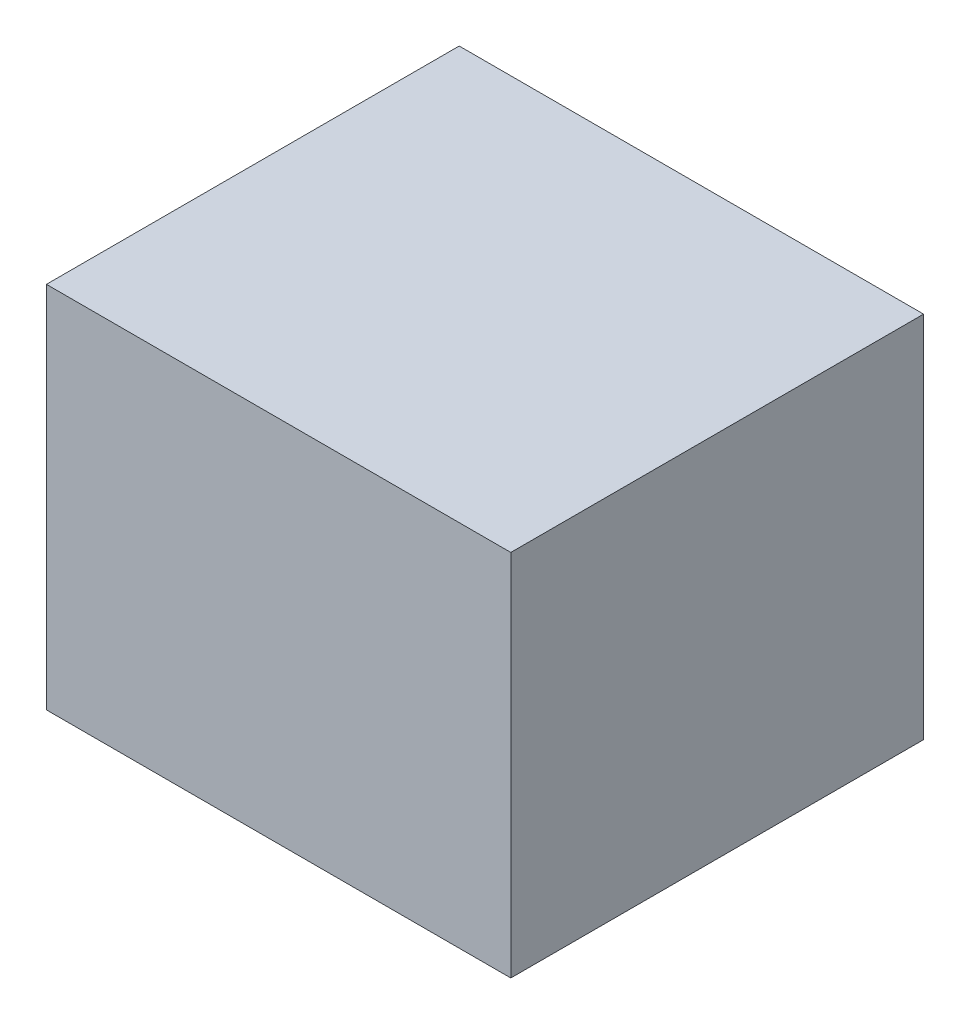
ISO-10303-21;
HEADER;
FILE_DESCRIPTION(('STEP AP214'),'2;1');
FILE_NAME('part.step','',(''),(''),'','','');
FILE_SCHEMA(('AUTOMOTIVE_DESIGN { 1 0 10303 214 1 1 1 1 }'));
ENDSEC;
DATA;
#1=APPLICATION_CONTEXT('core data for automotive mechanical design processes');
#2=APPLICATION_PROTOCOL_DEFINITION('international standard','automotive_design',2000,#1);
#3=PRODUCT_CONTEXT('',#1,'mechanical');
#4=PRODUCT('Part','Part','',(#3));
#5=PRODUCT_RELATED_PRODUCT_CATEGORY('part','',(#4));
#6=PRODUCT_DEFINITION_FORMATION('','',#4);
#7=PRODUCT_DEFINITION_CONTEXT('part definition',#1,'design');
#8=PRODUCT_DEFINITION('design','',#6,#7);
#9=PRODUCT_DEFINITION_SHAPE('','',#8);
#10=(LENGTH_UNIT() NAMED_UNIT(*) SI_UNIT(.MILLI.,.METRE.));
#11=(NAMED_UNIT(*) PLANE_ANGLE_UNIT() SI_UNIT($,.RADIAN.));
#12=(NAMED_UNIT(*) SI_UNIT($,.STERADIAN.) SOLID_ANGLE_UNIT());
#13=UNCERTAINTY_MEASURE_WITH_UNIT(LENGTH_MEASURE(1.E-05),#10,'distance_accuracy_value','');
#14=(GEOMETRIC_REPRESENTATION_CONTEXT(3) GLOBAL_UNCERTAINTY_ASSIGNED_CONTEXT((#13)) GLOBAL_UNIT_ASSIGNED_CONTEXT((#10,
#11,#12)) REPRESENTATION_CONTEXT('',''));
#15=CARTESIAN_POINT('',(0.,0.,0.));
#16=DIRECTION('',(0.,0.,1.));
#17=DIRECTION('',(1.,0.,0.));
#18=AXIS2_PLACEMENT_3D('',#15,#16,#17);
#19=CARTESIAN_POINT('',(3.14999878,2.50000008,0.));
#20=DIRECTION('',(0.,-1.,0.));
#21=DIRECTION('',(0.,0.,-1.));
#22=AXIS2_PLACEMENT_3D('',#19,#20,#21);
#23=PLANE('',#22);
#24=DIRECTION('',(0.,0.,-1.));
#25=VECTOR('',#24,1.);
#26=CARTESIAN_POINT('',(-3.14999878,2.50000008,0.));
#27=LINE('',#26,#25);
#28=CARTESIAN_POINT('',(-3.14999878,2.50000008,0.));
#29=VERTEX_POINT('',#28);
#30=CARTESIAN_POINT('',(-3.14999878,2.50000008,5.59999896));
#31=VERTEX_POINT('',#30);
#32=EDGE_CURVE('E20',#29,#31,#27,.F.);
#33=ORIENTED_EDGE('',*,*,#32,.T.);
#34=DIRECTION('',(-1.,0.,0.));
#35=VECTOR('',#34,1.);
#36=CARTESIAN_POINT('',(-3.14999878,2.50000008,5.59999896));
#37=LINE('',#36,#35);
#38=CARTESIAN_POINT('',(3.14999878,2.50000008,5.59999896));
#39=VERTEX_POINT('',#38);
#40=EDGE_CURVE('E55',#31,#39,#37,.F.);
#41=ORIENTED_EDGE('',*,*,#40,.T.);
#42=DIRECTION('',(0.,0.,1.));
#43=VECTOR('',#42,1.);
#44=CARTESIAN_POINT('',(3.14999878,2.50000008,0.));
#45=LINE('',#44,#43);
#46=CARTESIAN_POINT('',(3.14999878,2.50000008,0.));
#47=VERTEX_POINT('',#46);
#48=EDGE_CURVE('E76',#39,#47,#45,.F.);
#49=ORIENTED_EDGE('',*,*,#48,.T.);
#50=DIRECTION('',(-1.,0.,0.));
#51=VECTOR('',#50,1.);
#52=CARTESIAN_POINT('',(-3.14999878,2.50000008,0.));
#53=LINE('',#52,#51);
#54=EDGE_CURVE('E58',#29,#47,#53,.F.);
#55=ORIENTED_EDGE('',*,*,#54,.F.);
#56=EDGE_LOOP('',(#33,#41,#49,#55));
#57=FACE_BOUND('',#56,.T.);
#58=ADVANCED_FACE('F17',(#57),#23,.F.);
#59=CARTESIAN_POINT('',(-3.14999878,2.50000008,0.));
#60=DIRECTION('',(1.,0.,0.));
#61=DIRECTION('',(0.,0.,-1.));
#62=AXIS2_PLACEMENT_3D('',#59,#60,#61);
#63=PLANE('',#62);
#64=DIRECTION('',(0.,0.,1.));
#65=VECTOR('',#64,1.);
#66=CARTESIAN_POINT('',(-3.14999878,-2.50000008,0.));
#67=LINE('',#66,#65);
#68=CARTESIAN_POINT('',(-3.14999878,-2.50000008,0.));
#69=VERTEX_POINT('',#68);
#70=CARTESIAN_POINT('',(-3.14999878,-2.50000008,5.59999896));
#71=VERTEX_POINT('',#70);
#72=EDGE_CURVE('E73',#69,#71,#67,.T.);
#73=ORIENTED_EDGE('',*,*,#72,.T.);
#74=DIRECTION('',(0.,1.,0.));
#75=VECTOR('',#74,1.);
#76=CARTESIAN_POINT('',(-3.14999878,-2.50000008,5.59999896));
#77=LINE('',#76,#75);
#78=EDGE_CURVE('E63',#71,#31,#77,.T.);
#79=ORIENTED_EDGE('',*,*,#78,.T.);
#80=ORIENTED_EDGE('',*,*,#32,.F.);
#81=DIRECTION('',(0.,1.,0.));
#82=VECTOR('',#81,1.);
#83=CARTESIAN_POINT('',(-3.14999878,-2.50000008,0.));
#84=LINE('',#83,#82);
#85=EDGE_CURVE('E78',#69,#29,#84,.T.);
#86=ORIENTED_EDGE('',*,*,#85,.F.);
#87=EDGE_LOOP('',(#73,#79,#80,#86));
#88=FACE_BOUND('',#87,.T.);
#89=ADVANCED_FACE('F72',(#88),#63,.F.);
#90=CARTESIAN_POINT('',(-3.14999878,-2.50000008,5.59999896));
#91=DIRECTION('',(0.,0.,-1.));
#92=DIRECTION('',(-1.,0.,0.));
#93=AXIS2_PLACEMENT_3D('',#90,#91,#92);
#94=PLANE('',#93);
#95=DIRECTION('',(0.,1.,0.));
#96=VECTOR('',#95,1.);
#97=CARTESIAN_POINT('',(3.14999878,-2.50000008,5.59999896));
#98=LINE('',#97,#96);
#99=CARTESIAN_POINT('',(3.14999878,-2.50000008,5.59999896));
#100=VERTEX_POINT('',#99);
#101=EDGE_CURVE('E69',#100,#39,#98,.T.);
#102=ORIENTED_EDGE('',*,*,#101,.T.);
#103=ORIENTED_EDGE('',*,*,#40,.F.);
#104=ORIENTED_EDGE('',*,*,#78,.F.);
#105=DIRECTION('',(1.,0.,0.));
#106=VECTOR('',#105,1.);
#107=CARTESIAN_POINT('',(-3.14999878,-2.50000008,5.59999896));
#108=LINE('',#107,#106);
#109=EDGE_CURVE('E83',#71,#100,#108,.T.);
#110=ORIENTED_EDGE('',*,*,#109,.T.);
#111=EDGE_LOOP('',(#102,#103,#104,#110));
#112=FACE_BOUND('',#111,.T.);
#113=ADVANCED_FACE('F66',(#112),#94,.F.);
#114=CARTESIAN_POINT('',(3.14999878,-2.50000008,0.));
#115=DIRECTION('',(-1.,0.,0.));
#116=DIRECTION('',(0.,0.,1.));
#117=AXIS2_PLACEMENT_3D('',#114,#115,#116);
#118=PLANE('',#117);
#119=ORIENTED_EDGE('',*,*,#48,.F.);
#120=ORIENTED_EDGE('',*,*,#101,.F.);
#121=DIRECTION('',(0.,0.,1.));
#122=VECTOR('',#121,1.);
#123=CARTESIAN_POINT('',(3.14999878,-2.50000008,0.));
#124=LINE('',#123,#122);
#125=CARTESIAN_POINT('',(3.14999878,-2.50000008,0.));
#126=VERTEX_POINT('',#125);
#127=EDGE_CURVE('E26',#100,#126,#124,.F.);
#128=ORIENTED_EDGE('',*,*,#127,.T.);
#129=DIRECTION('',(0.,1.,0.));
#130=VECTOR('',#129,1.);
#131=CARTESIAN_POINT('',(3.14999878,-2.50000008,0.));
#132=LINE('',#131,#130);
#133=EDGE_CURVE('E34',#47,#126,#132,.F.);
#134=ORIENTED_EDGE('',*,*,#133,.F.);
#135=EDGE_LOOP('',(#119,#120,#128,#134));
#136=FACE_BOUND('',#135,.T.);
#137=ADVANCED_FACE('F88',(#136),#118,.F.);
#138=CARTESIAN_POINT('',(-3.14999878,-2.50000008,0.));
#139=DIRECTION('',(0.,0.,-1.));
#140=DIRECTION('',(-1.,0.,0.));
#141=AXIS2_PLACEMENT_3D('',#138,#139,#140);
#142=PLANE('',#141);
#143=ORIENTED_EDGE('',*,*,#133,.T.);
#144=DIRECTION('',(1.,0.,0.));
#145=VECTOR('',#144,1.);
#146=CARTESIAN_POINT('',(-3.14999878,-2.50000008,0.));
#147=LINE('',#146,#145);
#148=EDGE_CURVE('E11',#126,#69,#147,.F.);
#149=ORIENTED_EDGE('',*,*,#148,.T.);
#150=ORIENTED_EDGE('',*,*,#85,.T.);
#151=ORIENTED_EDGE('',*,*,#54,.T.);
#152=EDGE_LOOP('',(#143,#149,#150,#151));
#153=FACE_BOUND('',#152,.T.);
#154=ADVANCED_FACE('F91',(#153),#142,.T.);
#155=CARTESIAN_POINT('',(-3.14999878,-2.50000008,0.));
#156=DIRECTION('',(0.,1.,0.));
#157=DIRECTION('',(0.,0.,1.));
#158=AXIS2_PLACEMENT_3D('',#155,#156,#157);
#159=PLANE('',#158);
#160=ORIENTED_EDGE('',*,*,#127,.F.);
#161=ORIENTED_EDGE('',*,*,#109,.F.);
#162=ORIENTED_EDGE('',*,*,#72,.F.);
#163=ORIENTED_EDGE('',*,*,#148,.F.);
#164=EDGE_LOOP('',(#160,#161,#162,#163));
#165=FACE_BOUND('',#164,.T.);
#166=ADVANCED_FACE('F90',(#165),#159,.F.);
#167=CLOSED_SHELL('',(#58,#89,#113,#137,#154,#166));
#168=MANIFOLD_SOLID_BREP('B1',#167);
#169=ADVANCED_BREP_SHAPE_REPRESENTATION('',(#18,#168),#14);
#170=SHAPE_DEFINITION_REPRESENTATION(#9,#169);
ENDSEC;
END-ISO-10303-21;
